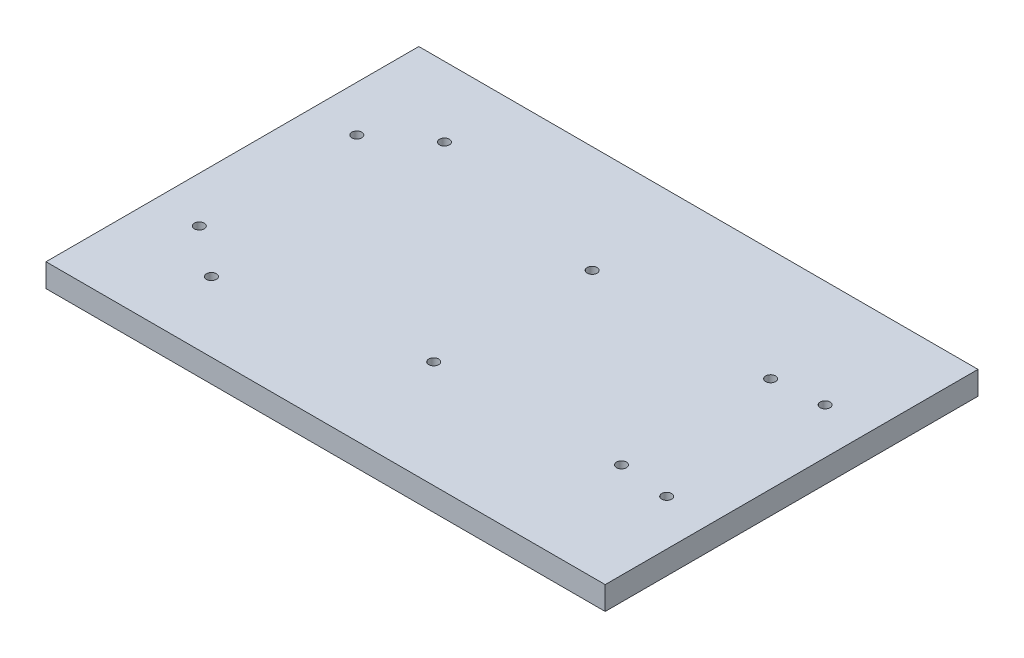
ISO-10303-21;
HEADER;
FILE_DESCRIPTION(('STEP AP214'),'2;1');
FILE_NAME('part.step','',(''),(''),'','','');
FILE_SCHEMA(('AUTOMOTIVE_DESIGN { 1 0 10303 214 1 1 1 1 }'));
ENDSEC;
DATA;
#1=APPLICATION_CONTEXT('core data for automotive mechanical design processes');
#2=APPLICATION_PROTOCOL_DEFINITION('international standard','automotive_design',2000,#1);
#3=PRODUCT_CONTEXT('',#1,'mechanical');
#4=PRODUCT('Part','Part','',(#3));
#5=PRODUCT_RELATED_PRODUCT_CATEGORY('part','',(#4));
#6=PRODUCT_DEFINITION_FORMATION('','',#4);
#7=PRODUCT_DEFINITION_CONTEXT('part definition',#1,'design');
#8=PRODUCT_DEFINITION('design','',#6,#7);
#9=PRODUCT_DEFINITION_SHAPE('','',#8);
#10=(LENGTH_UNIT() NAMED_UNIT(*) SI_UNIT(.MILLI.,.METRE.));
#11=(NAMED_UNIT(*) PLANE_ANGLE_UNIT() SI_UNIT($,.RADIAN.));
#12=(NAMED_UNIT(*) SI_UNIT($,.STERADIAN.) SOLID_ANGLE_UNIT());
#13=UNCERTAINTY_MEASURE_WITH_UNIT(LENGTH_MEASURE(1.E-05),#10,'distance_accuracy_value','');
#14=(GEOMETRIC_REPRESENTATION_CONTEXT(3) GLOBAL_UNCERTAINTY_ASSIGNED_CONTEXT((#13)) GLOBAL_UNIT_ASSIGNED_CONTEXT((#10,
#11,#12)) REPRESENTATION_CONTEXT('',''));
#15=CARTESIAN_POINT('',(0.,0.,0.));
#16=DIRECTION('',(0.,0.,1.));
#17=DIRECTION('',(1.,0.,0.));
#18=AXIS2_PLACEMENT_3D('',#15,#16,#17);
#19=CARTESIAN_POINT('',(-76.2,-6.35,0.));
#20=DIRECTION('',(1.,0.,0.));
#21=DIRECTION('',(0.,0.,-1.));
#22=AXIS2_PLACEMENT_3D('',#19,#20,#21);
#23=PLANE('',#22);
#24=DIRECTION('',(0.,0.,-1.));
#25=VECTOR('',#24,1.);
#26=CARTESIAN_POINT('',(-76.2,0.,0.));
#27=LINE('',#26,#25);
#28=CARTESIAN_POINT('',(-76.2,0.,50.8));
#29=VERTEX_POINT('',#28);
#30=CARTESIAN_POINT('',(-76.2,0.,-50.8));
#31=VERTEX_POINT('',#30);
#32=EDGE_CURVE('E108',#29,#31,#27,.T.);
#33=ORIENTED_EDGE('',*,*,#32,.T.);
#34=DIRECTION('',(0.,1.,0.));
#35=VECTOR('',#34,1.);
#36=CARTESIAN_POINT('',(-76.2,-6.35,-50.8));
#37=LINE('',#36,#35);
#38=CARTESIAN_POINT('',(-76.2,-6.35,-50.8));
#39=VERTEX_POINT('',#38);
#40=EDGE_CURVE('E11',#39,#31,#37,.T.);
#41=ORIENTED_EDGE('',*,*,#40,.F.);
#42=DIRECTION('',(0.,0.,-1.));
#43=VECTOR('',#42,1.);
#44=CARTESIAN_POINT('',(-76.2,-6.35,0.));
#45=LINE('',#44,#43);
#46=CARTESIAN_POINT('',(-76.2,-6.35,50.8));
#47=VERTEX_POINT('',#46);
#48=EDGE_CURVE('E60',#47,#39,#45,.T.);
#49=ORIENTED_EDGE('',*,*,#48,.F.);
#50=DIRECTION('',(0.,1.,0.));
#51=VECTOR('',#50,1.);
#52=CARTESIAN_POINT('',(-76.2,-6.35,50.8));
#53=LINE('',#52,#51);
#54=EDGE_CURVE('E44',#47,#29,#53,.T.);
#55=ORIENTED_EDGE('',*,*,#54,.T.);
#56=EDGE_LOOP('',(#33,#41,#49,#55));
#57=FACE_BOUND('',#56,.T.);
#58=ADVANCED_FACE('F41',(#57),#23,.F.);
#59=CARTESIAN_POINT('',(0.,-6.35,-50.8));
#60=DIRECTION('',(0.,0.,-1.));
#61=DIRECTION('',(-1.,0.,0.));
#62=AXIS2_PLACEMENT_3D('',#59,#60,#61);
#63=PLANE('',#62);
#64=DIRECTION('',(-1.,0.,0.));
#65=VECTOR('',#64,1.);
#66=CARTESIAN_POINT('',(0.,0.,-50.8));
#67=LINE('',#66,#65);
#68=CARTESIAN_POINT('',(76.2,0.,-50.8));
#69=VERTEX_POINT('',#68);
#70=EDGE_CURVE('E117',#69,#31,#67,.T.);
#71=ORIENTED_EDGE('',*,*,#70,.F.);
#72=DIRECTION('',(0.,1.,0.));
#73=VECTOR('',#72,1.);
#74=CARTESIAN_POINT('',(76.2,-6.35,-50.8));
#75=LINE('',#74,#73);
#76=CARTESIAN_POINT('',(76.2,-6.35,-50.8));
#77=VERTEX_POINT('',#76);
#78=EDGE_CURVE('E51',#77,#69,#75,.T.);
#79=ORIENTED_EDGE('',*,*,#78,.F.);
#80=DIRECTION('',(-1.,0.,0.));
#81=VECTOR('',#80,1.);
#82=CARTESIAN_POINT('',(0.,-6.35,-50.8));
#83=LINE('',#82,#81);
#84=EDGE_CURVE('E101',#77,#39,#83,.T.);
#85=ORIENTED_EDGE('',*,*,#84,.T.);
#86=ORIENTED_EDGE('',*,*,#40,.T.);
#87=EDGE_LOOP('',(#71,#79,#85,#86));
#88=FACE_BOUND('',#87,.T.);
#89=ADVANCED_FACE('F127',(#88),#63,.T.);
#90=CARTESIAN_POINT('',(76.2,-6.35,0.));
#91=DIRECTION('',(1.,0.,0.));
#92=DIRECTION('',(0.,0.,-1.));
#93=AXIS2_PLACEMENT_3D('',#90,#91,#92);
#94=PLANE('',#93);
#95=DIRECTION('',(0.,0.,-1.));
#96=VECTOR('',#95,1.);
#97=CARTESIAN_POINT('',(76.2,0.,0.));
#98=LINE('',#97,#96);
#99=CARTESIAN_POINT('',(76.2,0.,50.8));
#100=VERTEX_POINT('',#99);
#101=EDGE_CURVE('E92',#100,#69,#98,.T.);
#102=ORIENTED_EDGE('',*,*,#101,.F.);
#103=DIRECTION('',(0.,1.,0.));
#104=VECTOR('',#103,1.);
#105=CARTESIAN_POINT('',(76.2,-6.35,50.8));
#106=LINE('',#105,#104);
#107=CARTESIAN_POINT('',(76.2,-6.35,50.8));
#108=VERTEX_POINT('',#107);
#109=EDGE_CURVE('E89',#108,#100,#106,.T.);
#110=ORIENTED_EDGE('',*,*,#109,.F.);
#111=DIRECTION('',(0.,0.,-1.));
#112=VECTOR('',#111,1.);
#113=CARTESIAN_POINT('',(76.2,-6.35,0.));
#114=LINE('',#113,#112);
#115=EDGE_CURVE('E91',#108,#77,#114,.T.);
#116=ORIENTED_EDGE('',*,*,#115,.T.);
#117=ORIENTED_EDGE('',*,*,#78,.T.);
#118=EDGE_LOOP('',(#102,#110,#116,#117));
#119=FACE_BOUND('',#118,.T.);
#120=ADVANCED_FACE('F90',(#119),#94,.T.);
#121=CARTESIAN_POINT('',(0.,-6.35,50.8));
#122=DIRECTION('',(0.,0.,-1.));
#123=DIRECTION('',(-1.,0.,0.));
#124=AXIS2_PLACEMENT_3D('',#121,#122,#123);
#125=PLANE('',#124);
#126=DIRECTION('',(-1.,0.,0.));
#127=VECTOR('',#126,1.);
#128=CARTESIAN_POINT('',(0.,0.,50.8));
#129=LINE('',#128,#127);
#130=EDGE_CURVE('E111',#100,#29,#129,.T.);
#131=ORIENTED_EDGE('',*,*,#130,.T.);
#132=ORIENTED_EDGE('',*,*,#54,.F.);
#133=DIRECTION('',(-1.,0.,0.));
#134=VECTOR('',#133,1.);
#135=CARTESIAN_POINT('',(0.,-6.35,50.8));
#136=LINE('',#135,#134);
#137=EDGE_CURVE('E86',#108,#47,#136,.T.);
#138=ORIENTED_EDGE('',*,*,#137,.F.);
#139=ORIENTED_EDGE('',*,*,#109,.T.);
#140=EDGE_LOOP('',(#131,#132,#138,#139));
#141=FACE_BOUND('',#140,.T.);
#142=ADVANCED_FACE('F96',(#141),#125,.F.);
#143=CARTESIAN_POINT('',(0.,-6.35,0.));
#144=DIRECTION('',(0.,1.,0.));
#145=DIRECTION('',(0.,0.,1.));
#146=AXIS2_PLACEMENT_3D('',#143,#144,#145);
#147=PLANE('',#146);
#148=CARTESIAN_POINT('',(-50.165,-6.34999999999999,-31.75));
#149=DIRECTION('',(0.,1.,0.));
#150=DIRECTION('',(0.,0.,1.));
#151=AXIS2_PLACEMENT_3D('',#148,#149,#150);
#152=CIRCLE('',#151,1.35254999999999);
#153=CARTESIAN_POINT('',(-50.165,-6.34999999999999,-30.39745));
#154=VERTEX_POINT('',#153);
#155=EDGE_CURVE('E192',#154,#154,#152,.T.);
#156=ORIENTED_EDGE('',*,*,#155,.T.);
#157=EDGE_LOOP('',(#156));
#158=FACE_BOUND('',#157,.T.);
#159=CARTESIAN_POINT('',(-50.165,-6.34999999999999,31.75));
#160=DIRECTION('',(0.,1.,0.));
#161=DIRECTION('',(0.,0.,1.));
#162=AXIS2_PLACEMENT_3D('',#159,#160,#161);
#163=CIRCLE('',#162,1.35254999999999);
#164=CARTESIAN_POINT('',(-50.165,-6.34999999999999,33.10255));
#165=VERTEX_POINT('',#164);
#166=EDGE_CURVE('E205',#165,#165,#163,.T.);
#167=ORIENTED_EDGE('',*,*,#166,.T.);
#168=EDGE_LOOP('',(#167));
#169=FACE_BOUND('',#168,.T.);
#170=CARTESIAN_POINT('',(50.165,-6.34999999999999,20.32));
#171=DIRECTION('',(0.,1.,0.));
#172=DIRECTION('',(0.,0.,1.));
#173=AXIS2_PLACEMENT_3D('',#170,#171,#172);
#174=CIRCLE('',#173,1.35254999999999);
#175=CARTESIAN_POINT('',(50.165,-6.34999999999999,21.67255));
#176=VERTEX_POINT('',#175);
#177=EDGE_CURVE('E213',#176,#176,#174,.T.);
#178=ORIENTED_EDGE('',*,*,#177,.T.);
#179=EDGE_LOOP('',(#178));
#180=FACE_BOUND('',#179,.T.);
#181=CARTESIAN_POINT('',(50.165,-6.34999999999999,-20.32));
#182=DIRECTION('',(0.,1.,0.));
#183=DIRECTION('',(0.,0.,1.));
#184=AXIS2_PLACEMENT_3D('',#181,#182,#183);
#185=CIRCLE('',#184,1.35254999999999);
#186=CARTESIAN_POINT('',(50.165,-6.34999999999999,-18.96745));
#187=VERTEX_POINT('',#186);
#188=EDGE_CURVE('E221',#187,#187,#185,.T.);
#189=ORIENTED_EDGE('',*,*,#188,.T.);
#190=EDGE_LOOP('',(#189));
#191=FACE_BOUND('',#190,.T.);
#192=CARTESIAN_POINT('',(-63.7538735038427,-6.34999999999999,-21.463));
#193=DIRECTION('',(0.,1.,0.));
#194=DIRECTION('',(0.,0.,1.));
#195=AXIS2_PLACEMENT_3D('',#192,#193,#194);
#196=CIRCLE('',#195,1.35254999999999);
#197=CARTESIAN_POINT('',(-63.7538735038427,-6.34999999999999,-20.11045));
#198=VERTEX_POINT('',#197);
#199=EDGE_CURVE('E229',#198,#198,#196,.T.);
#200=ORIENTED_EDGE('',*,*,#199,.T.);
#201=EDGE_LOOP('',(#200));
#202=FACE_BOUND('',#201,.T.);
#203=CARTESIAN_POINT('',(0.253999998502153,-6.34999999999999,-21.5902545001627));
#204=DIRECTION('',(0.,1.,0.));
#205=DIRECTION('',(0.,0.,1.));
#206=AXIS2_PLACEMENT_3D('',#203,#204,#205);
#207=CIRCLE('',#206,1.35254999999999);
#208=CARTESIAN_POINT('',(0.253999998502153,-6.34999999999999,-20.2377045001627));
#209=VERTEX_POINT('',#208);
#210=EDGE_CURVE('E237',#209,#209,#207,.T.);
#211=ORIENTED_EDGE('',*,*,#210,.T.);
#212=EDGE_LOOP('',(#211));
#213=FACE_BOUND('',#212,.T.);
#214=CARTESIAN_POINT('',(63.7539999979921,-6.34999999999999,-21.59));
#215=DIRECTION('',(0.,1.,0.));
#216=DIRECTION('',(0.,0.,1.));
#217=AXIS2_PLACEMENT_3D('',#214,#215,#216);
#218=CIRCLE('',#217,1.35254999999998);
#219=CARTESIAN_POINT('',(63.7539999979921,-6.34999999999999,-20.23745));
#220=VERTEX_POINT('',#219);
#221=EDGE_CURVE('E245',#220,#220,#218,.T.);
#222=ORIENTED_EDGE('',*,*,#221,.T.);
#223=EDGE_LOOP('',(#222));
#224=FACE_BOUND('',#223,.T.);
#225=CARTESIAN_POINT('',(63.7539999979921,-6.34999999999999,21.59));
#226=DIRECTION('',(0.,1.,0.));
#227=DIRECTION('',(0.,0.,1.));
#228=AXIS2_PLACEMENT_3D('',#225,#226,#227);
#229=CIRCLE('',#228,1.35254999999998);
#230=CARTESIAN_POINT('',(63.7539999979921,-6.34999999999999,22.94255));
#231=VERTEX_POINT('',#230);
#232=EDGE_CURVE('E253',#231,#231,#229,.T.);
#233=ORIENTED_EDGE('',*,*,#232,.T.);
#234=EDGE_LOOP('',(#233));
#235=FACE_BOUND('',#234,.T.);
#236=CARTESIAN_POINT('',(0.253999998502153,-6.34999999999999,21.5897454998373));
#237=DIRECTION('',(0.,1.,0.));
#238=DIRECTION('',(0.,0.,1.));
#239=AXIS2_PLACEMENT_3D('',#236,#237,#238);
#240=CIRCLE('',#239,1.35254999999999);
#241=CARTESIAN_POINT('',(0.253999998502153,-6.34999999999999,22.9422954998373));
#242=VERTEX_POINT('',#241);
#243=EDGE_CURVE('E261',#242,#242,#240,.T.);
#244=ORIENTED_EDGE('',*,*,#243,.T.);
#245=EDGE_LOOP('',(#244));
#246=FACE_BOUND('',#245,.T.);
#247=CARTESIAN_POINT('',(-63.7538735038427,-6.34999999999999,21.463));
#248=DIRECTION('',(0.,1.,0.));
#249=DIRECTION('',(0.,0.,1.));
#250=AXIS2_PLACEMENT_3D('',#247,#248,#249);
#251=CIRCLE('',#250,1.35254999999999);
#252=CARTESIAN_POINT('',(-63.7538735038427,-6.34999999999999,22.81555));
#253=VERTEX_POINT('',#252);
#254=EDGE_CURVE('E112',#253,#253,#251,.T.);
#255=ORIENTED_EDGE('',*,*,#254,.T.);
#256=EDGE_LOOP('',(#255));
#257=FACE_BOUND('',#256,.T.);
#258=ORIENTED_EDGE('',*,*,#48,.T.);
#259=ORIENTED_EDGE('',*,*,#84,.F.);
#260=ORIENTED_EDGE('',*,*,#115,.F.);
#261=ORIENTED_EDGE('',*,*,#137,.T.);
#262=EDGE_LOOP('',(#258,#259,#260,#261));
#263=FACE_BOUND('',#262,.T.);
#264=ADVANCED_FACE('F100',(#158,#169,#180,#191,#202,#213,#224,#235,#246,#257,#263),#147,.F.);
#265=CARTESIAN_POINT('',(0.,0.,0.));
#266=DIRECTION('',(0.,1.,0.));
#267=DIRECTION('',(0.,0.,1.));
#268=AXIS2_PLACEMENT_3D('',#265,#266,#267);
#269=PLANE('',#268);
#270=CARTESIAN_POINT('',(-50.165,0.,-31.75));
#271=DIRECTION('',(0.,1.,0.));
#272=DIRECTION('',(0.,0.,1.));
#273=AXIS2_PLACEMENT_3D('',#270,#271,#272);
#274=CIRCLE('',#273,1.35254999999999);
#275=CARTESIAN_POINT('',(-50.165,0.,-30.39745));
#276=VERTEX_POINT('',#275);
#277=EDGE_CURVE('E195',#276,#276,#274,.T.);
#278=ORIENTED_EDGE('',*,*,#277,.F.);
#279=EDGE_LOOP('',(#278));
#280=FACE_BOUND('',#279,.T.);
#281=CARTESIAN_POINT('',(-50.165,0.,31.75));
#282=DIRECTION('',(0.,1.,0.));
#283=DIRECTION('',(0.,0.,1.));
#284=AXIS2_PLACEMENT_3D('',#281,#282,#283);
#285=CIRCLE('',#284,1.35254999999999);
#286=CARTESIAN_POINT('',(-50.165,0.,33.10255));
#287=VERTEX_POINT('',#286);
#288=EDGE_CURVE('E199',#287,#287,#285,.T.);
#289=ORIENTED_EDGE('',*,*,#288,.F.);
#290=EDGE_LOOP('',(#289));
#291=FACE_BOUND('',#290,.T.);
#292=CARTESIAN_POINT('',(50.165,0.,20.32));
#293=DIRECTION('',(0.,1.,0.));
#294=DIRECTION('',(0.,0.,1.));
#295=AXIS2_PLACEMENT_3D('',#292,#293,#294);
#296=CIRCLE('',#295,1.35254999999999);
#297=CARTESIAN_POINT('',(50.165,0.,21.67255));
#298=VERTEX_POINT('',#297);
#299=EDGE_CURVE('E209',#298,#298,#296,.T.);
#300=ORIENTED_EDGE('',*,*,#299,.F.);
#301=EDGE_LOOP('',(#300));
#302=FACE_BOUND('',#301,.T.);
#303=CARTESIAN_POINT('',(50.165,0.,-20.32));
#304=DIRECTION('',(0.,1.,0.));
#305=DIRECTION('',(0.,0.,1.));
#306=AXIS2_PLACEMENT_3D('',#303,#304,#305);
#307=CIRCLE('',#306,1.35254999999999);
#308=CARTESIAN_POINT('',(50.165,0.,-18.96745));
#309=VERTEX_POINT('',#308);
#310=EDGE_CURVE('E217',#309,#309,#307,.T.);
#311=ORIENTED_EDGE('',*,*,#310,.F.);
#312=EDGE_LOOP('',(#311));
#313=FACE_BOUND('',#312,.T.);
#314=CARTESIAN_POINT('',(-63.7538735038427,0.,-21.463));
#315=DIRECTION('',(0.,1.,0.));
#316=DIRECTION('',(0.,0.,1.));
#317=AXIS2_PLACEMENT_3D('',#314,#315,#316);
#318=CIRCLE('',#317,1.35254999999999);
#319=CARTESIAN_POINT('',(-63.7538735038427,0.,-20.11045));
#320=VERTEX_POINT('',#319);
#321=EDGE_CURVE('E225',#320,#320,#318,.T.);
#322=ORIENTED_EDGE('',*,*,#321,.F.);
#323=EDGE_LOOP('',(#322));
#324=FACE_BOUND('',#323,.T.);
#325=CARTESIAN_POINT('',(0.253999998502153,0.,-21.5902545001627));
#326=DIRECTION('',(0.,1.,0.));
#327=DIRECTION('',(0.,0.,1.));
#328=AXIS2_PLACEMENT_3D('',#325,#326,#327);
#329=CIRCLE('',#328,1.35254999999999);
#330=CARTESIAN_POINT('',(0.253999998502153,0.,-20.2377045001627));
#331=VERTEX_POINT('',#330);
#332=EDGE_CURVE('E233',#331,#331,#329,.T.);
#333=ORIENTED_EDGE('',*,*,#332,.F.);
#334=EDGE_LOOP('',(#333));
#335=FACE_BOUND('',#334,.T.);
#336=CARTESIAN_POINT('',(63.7539999979921,0.,-21.59));
#337=DIRECTION('',(0.,1.,0.));
#338=DIRECTION('',(0.,0.,1.));
#339=AXIS2_PLACEMENT_3D('',#336,#337,#338);
#340=CIRCLE('',#339,1.35254999999998);
#341=CARTESIAN_POINT('',(63.7539999979921,0.,-20.23745));
#342=VERTEX_POINT('',#341);
#343=EDGE_CURVE('E241',#342,#342,#340,.T.);
#344=ORIENTED_EDGE('',*,*,#343,.F.);
#345=EDGE_LOOP('',(#344));
#346=FACE_BOUND('',#345,.T.);
#347=CARTESIAN_POINT('',(63.7539999979921,0.,21.59));
#348=DIRECTION('',(0.,1.,0.));
#349=DIRECTION('',(0.,0.,1.));
#350=AXIS2_PLACEMENT_3D('',#347,#348,#349);
#351=CIRCLE('',#350,1.35254999999998);
#352=CARTESIAN_POINT('',(63.7539999979921,0.,22.94255));
#353=VERTEX_POINT('',#352);
#354=EDGE_CURVE('E249',#353,#353,#351,.T.);
#355=ORIENTED_EDGE('',*,*,#354,.F.);
#356=EDGE_LOOP('',(#355));
#357=FACE_BOUND('',#356,.T.);
#358=CARTESIAN_POINT('',(0.253999998502153,0.,21.5897454998373));
#359=DIRECTION('',(0.,1.,0.));
#360=DIRECTION('',(0.,0.,1.));
#361=AXIS2_PLACEMENT_3D('',#358,#359,#360);
#362=CIRCLE('',#361,1.35254999999999);
#363=CARTESIAN_POINT('',(0.253999998502153,0.,22.9422954998373));
#364=VERTEX_POINT('',#363);
#365=EDGE_CURVE('E257',#364,#364,#362,.T.);
#366=ORIENTED_EDGE('',*,*,#365,.F.);
#367=EDGE_LOOP('',(#366));
#368=FACE_BOUND('',#367,.T.);
#369=CARTESIAN_POINT('',(-63.7538735038427,0.,21.463));
#370=DIRECTION('',(0.,1.,0.));
#371=DIRECTION('',(0.,0.,1.));
#372=AXIS2_PLACEMENT_3D('',#369,#370,#371);
#373=CIRCLE('',#372,1.35254999999999);
#374=CARTESIAN_POINT('',(-63.7538735038427,0.,22.81555));
#375=VERTEX_POINT('',#374);
#376=EDGE_CURVE('E265',#375,#375,#373,.T.);
#377=ORIENTED_EDGE('',*,*,#376,.F.);
#378=EDGE_LOOP('',(#377));
#379=FACE_BOUND('',#378,.T.);
#380=ORIENTED_EDGE('',*,*,#32,.F.);
#381=ORIENTED_EDGE('',*,*,#130,.F.);
#382=ORIENTED_EDGE('',*,*,#101,.T.);
#383=ORIENTED_EDGE('',*,*,#70,.T.);
#384=EDGE_LOOP('',(#380,#381,#382,#383));
#385=FACE_BOUND('',#384,.T.);
#386=ADVANCED_FACE('F126',(#280,#291,#302,#313,#324,#335,#346,#357,#368,#379,#385),#269,.T.);
#387=CARTESIAN_POINT('',(-63.7538735038427,0.,21.463));
#388=DIRECTION('',(0.,1.,0.));
#389=DIRECTION('',(0.,0.,1.));
#390=AXIS2_PLACEMENT_3D('',#387,#388,#389);
#391=CYLINDRICAL_SURFACE('',#390,1.35254999999999);
#392=ORIENTED_EDGE('',*,*,#254,.F.);
#393=EDGE_LOOP('',(#392));
#394=FACE_BOUND('',#393,.T.);
#395=ORIENTED_EDGE('',*,*,#376,.T.);
#396=EDGE_LOOP('',(#395));
#397=FACE_BOUND('',#396,.T.);
#398=ADVANCED_FACE('F145',(#394,#397),#391,.F.);
#399=CARTESIAN_POINT('',(0.253999998502153,0.,21.5897454998373));
#400=DIRECTION('',(0.,1.,0.));
#401=DIRECTION('',(0.,0.,1.));
#402=AXIS2_PLACEMENT_3D('',#399,#400,#401);
#403=CYLINDRICAL_SURFACE('',#402,1.35254999999999);
#404=ORIENTED_EDGE('',*,*,#243,.F.);
#405=EDGE_LOOP('',(#404));
#406=FACE_BOUND('',#405,.T.);
#407=ORIENTED_EDGE('',*,*,#365,.T.);
#408=EDGE_LOOP('',(#407));
#409=FACE_BOUND('',#408,.T.);
#410=ADVANCED_FACE('F152',(#406,#409),#403,.F.);
#411=CARTESIAN_POINT('',(63.7539999979921,0.,21.59));
#412=DIRECTION('',(0.,1.,0.));
#413=DIRECTION('',(0.,0.,1.));
#414=AXIS2_PLACEMENT_3D('',#411,#412,#413);
#415=CYLINDRICAL_SURFACE('',#414,1.35254999999998);
#416=ORIENTED_EDGE('',*,*,#232,.F.);
#417=EDGE_LOOP('',(#416));
#418=FACE_BOUND('',#417,.T.);
#419=ORIENTED_EDGE('',*,*,#354,.T.);
#420=EDGE_LOOP('',(#419));
#421=FACE_BOUND('',#420,.T.);
#422=ADVANCED_FACE('F156',(#418,#421),#415,.F.);
#423=CARTESIAN_POINT('',(63.7539999979921,0.,-21.59));
#424=DIRECTION('',(0.,1.,0.));
#425=DIRECTION('',(0.,0.,1.));
#426=AXIS2_PLACEMENT_3D('',#423,#424,#425);
#427=CYLINDRICAL_SURFACE('',#426,1.35254999999998);
#428=ORIENTED_EDGE('',*,*,#221,.F.);
#429=EDGE_LOOP('',(#428));
#430=FACE_BOUND('',#429,.T.);
#431=ORIENTED_EDGE('',*,*,#343,.T.);
#432=EDGE_LOOP('',(#431));
#433=FACE_BOUND('',#432,.T.);
#434=ADVANCED_FACE('F160',(#430,#433),#427,.F.);
#435=CARTESIAN_POINT('',(0.253999998502153,0.,-21.5902545001627));
#436=DIRECTION('',(0.,1.,0.));
#437=DIRECTION('',(0.,0.,1.));
#438=AXIS2_PLACEMENT_3D('',#435,#436,#437);
#439=CYLINDRICAL_SURFACE('',#438,1.35254999999999);
#440=ORIENTED_EDGE('',*,*,#210,.F.);
#441=EDGE_LOOP('',(#440));
#442=FACE_BOUND('',#441,.T.);
#443=ORIENTED_EDGE('',*,*,#332,.T.);
#444=EDGE_LOOP('',(#443));
#445=FACE_BOUND('',#444,.T.);
#446=ADVANCED_FACE('F164',(#442,#445),#439,.F.);
#447=CARTESIAN_POINT('',(-63.7538735038427,0.,-21.463));
#448=DIRECTION('',(0.,1.,0.));
#449=DIRECTION('',(0.,0.,1.));
#450=AXIS2_PLACEMENT_3D('',#447,#448,#449);
#451=CYLINDRICAL_SURFACE('',#450,1.35254999999999);
#452=ORIENTED_EDGE('',*,*,#199,.F.);
#453=EDGE_LOOP('',(#452));
#454=FACE_BOUND('',#453,.T.);
#455=ORIENTED_EDGE('',*,*,#321,.T.);
#456=EDGE_LOOP('',(#455));
#457=FACE_BOUND('',#456,.T.);
#458=ADVANCED_FACE('F168',(#454,#457),#451,.F.);
#459=CARTESIAN_POINT('',(50.165,0.,-20.32));
#460=DIRECTION('',(0.,1.,0.));
#461=DIRECTION('',(0.,0.,1.));
#462=AXIS2_PLACEMENT_3D('',#459,#460,#461);
#463=CYLINDRICAL_SURFACE('',#462,1.35254999999999);
#464=ORIENTED_EDGE('',*,*,#188,.F.);
#465=EDGE_LOOP('',(#464));
#466=FACE_BOUND('',#465,.T.);
#467=ORIENTED_EDGE('',*,*,#310,.T.);
#468=EDGE_LOOP('',(#467));
#469=FACE_BOUND('',#468,.T.);
#470=ADVANCED_FACE('F172',(#466,#469),#463,.F.);
#471=CARTESIAN_POINT('',(50.165,0.,20.32));
#472=DIRECTION('',(0.,1.,0.));
#473=DIRECTION('',(0.,0.,1.));
#474=AXIS2_PLACEMENT_3D('',#471,#472,#473);
#475=CYLINDRICAL_SURFACE('',#474,1.35254999999999);
#476=ORIENTED_EDGE('',*,*,#177,.F.);
#477=EDGE_LOOP('',(#476));
#478=FACE_BOUND('',#477,.T.);
#479=ORIENTED_EDGE('',*,*,#299,.T.);
#480=EDGE_LOOP('',(#479));
#481=FACE_BOUND('',#480,.T.);
#482=ADVANCED_FACE('F176',(#478,#481),#475,.F.);
#483=CARTESIAN_POINT('',(-50.165,0.,31.75));
#484=DIRECTION('',(0.,1.,0.));
#485=DIRECTION('',(0.,0.,1.));
#486=AXIS2_PLACEMENT_3D('',#483,#484,#485);
#487=CYLINDRICAL_SURFACE('',#486,1.35254999999999);
#488=ORIENTED_EDGE('',*,*,#166,.F.);
#489=EDGE_LOOP('',(#488));
#490=FACE_BOUND('',#489,.T.);
#491=ORIENTED_EDGE('',*,*,#288,.T.);
#492=EDGE_LOOP('',(#491));
#493=FACE_BOUND('',#492,.T.);
#494=ADVANCED_FACE('F180',(#490,#493),#487,.F.);
#495=CARTESIAN_POINT('',(-50.165,0.,-31.75));
#496=DIRECTION('',(0.,1.,0.));
#497=DIRECTION('',(0.,0.,1.));
#498=AXIS2_PLACEMENT_3D('',#495,#496,#497);
#499=CYLINDRICAL_SURFACE('',#498,1.35254999999999);
#500=ORIENTED_EDGE('',*,*,#155,.F.);
#501=EDGE_LOOP('',(#500));
#502=FACE_BOUND('',#501,.T.);
#503=ORIENTED_EDGE('',*,*,#277,.T.);
#504=EDGE_LOOP('',(#503));
#505=FACE_BOUND('',#504,.T.);
#506=ADVANCED_FACE('F184',(#502,#505),#499,.F.);
#507=CLOSED_SHELL('',(#58,#89,#120,#142,#264,#386,#398,#410,#422,#434,#446,#458,#470,#482,#494,#506));
#508=MANIFOLD_SOLID_BREP('B2',#507);
#509=ADVANCED_BREP_SHAPE_REPRESENTATION('',(#18,#508),#14);
#510=SHAPE_DEFINITION_REPRESENTATION(#9,#509);
ENDSEC;
END-ISO-10303-21;
